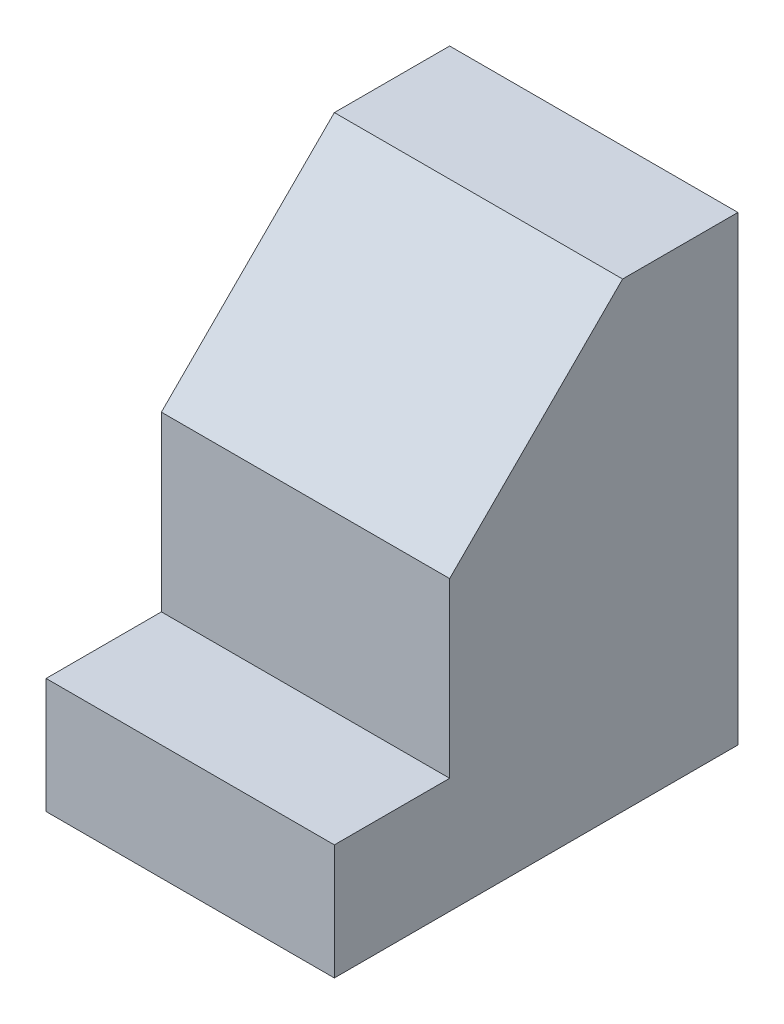
ISO-10303-21;
HEADER;
FILE_DESCRIPTION(('STEP AP214'),'2;1');
FILE_NAME('part.step','',(''),(''),'','','');
FILE_SCHEMA(('AUTOMOTIVE_DESIGN { 1 0 10303 214 1 1 1 1 }'));
ENDSEC;
DATA;
#1=APPLICATION_CONTEXT('core data for automotive mechanical design processes');
#2=APPLICATION_PROTOCOL_DEFINITION('international standard','automotive_design',2000,#1);
#3=PRODUCT_CONTEXT('',#1,'mechanical');
#4=PRODUCT('Part','Part','',(#3));
#5=PRODUCT_RELATED_PRODUCT_CATEGORY('part','',(#4));
#6=PRODUCT_DEFINITION_FORMATION('','',#4);
#7=PRODUCT_DEFINITION_CONTEXT('part definition',#1,'design');
#8=PRODUCT_DEFINITION('design','',#6,#7);
#9=PRODUCT_DEFINITION_SHAPE('','',#8);
#10=(LENGTH_UNIT() NAMED_UNIT(*) SI_UNIT(.MILLI.,.METRE.));
#11=(NAMED_UNIT(*) PLANE_ANGLE_UNIT() SI_UNIT($,.RADIAN.));
#12=(NAMED_UNIT(*) SI_UNIT($,.STERADIAN.) SOLID_ANGLE_UNIT());
#13=UNCERTAINTY_MEASURE_WITH_UNIT(LENGTH_MEASURE(1.E-05),#10,'distance_accuracy_value','');
#14=(GEOMETRIC_REPRESENTATION_CONTEXT(3) GLOBAL_UNCERTAINTY_ASSIGNED_CONTEXT((#13)) GLOBAL_UNIT_ASSIGNED_CONTEXT((#10,
#11,#12)) REPRESENTATION_CONTEXT('',''));
#15=CARTESIAN_POINT('',(0.,0.,0.));
#16=DIRECTION('',(0.,0.,1.));
#17=DIRECTION('',(1.,0.,0.));
#18=AXIS2_PLACEMENT_3D('',#15,#16,#17);
#19=CARTESIAN_POINT('',(0.,10000.,0.));
#20=DIRECTION('',(0.,-1.,0.));
#21=DIRECTION('',(0.,0.,-1.));
#22=AXIS2_PLACEMENT_3D('',#19,#20,#21);
#23=PLANE('',#22);
#24=DIRECTION('',(1.,0.,0.));
#25=VECTOR('',#24,1.);
#26=CARTESIAN_POINT('',(0.,10000.,-10000.));
#27=LINE('',#26,#25);
#28=CARTESIAN_POINT('',(3.06161699786838E-12,10000.,-10000.));
#29=VERTEX_POINT('',#28);
#30=CARTESIAN_POINT('',(25000.,10000.,-10000.));
#31=VERTEX_POINT('',#30);
#32=EDGE_CURVE('E109',#29,#31,#27,.T.);
#33=ORIENTED_EDGE('',*,*,#32,.F.);
#34=DIRECTION('',(0.,0.,-1.));
#35=VECTOR('',#34,1.);
#36=CARTESIAN_POINT('',(0.,10000.,0.));
#37=LINE('',#36,#35);
#38=CARTESIAN_POINT('',(0.,10000.,0.));
#39=VERTEX_POINT('',#38);
#40=EDGE_CURVE('E101',#39,#29,#37,.T.);
#41=ORIENTED_EDGE('',*,*,#40,.F.);
#42=DIRECTION('',(1.,0.,0.));
#43=VECTOR('',#42,1.);
#44=CARTESIAN_POINT('',(0.,10000.,0.));
#45=LINE('',#44,#43);
#46=CARTESIAN_POINT('',(25000.,10000.,0.));
#47=VERTEX_POINT('',#46);
#48=EDGE_CURVE('E90',#39,#47,#45,.T.);
#49=ORIENTED_EDGE('',*,*,#48,.T.);
#50=DIRECTION('',(0.,0.,1.));
#51=VECTOR('',#50,1.);
#52=CARTESIAN_POINT('',(25000.,10000.,-35000.));
#53=LINE('',#52,#51);
#54=EDGE_CURVE('E129',#31,#47,#53,.T.);
#55=ORIENTED_EDGE('',*,*,#54,.F.);
#56=EDGE_LOOP('',(#33,#41,#49,#55));
#57=FACE_BOUND('',#56,.T.);
#58=ADVANCED_FACE('F43',(#57),#23,.F.);
#59=CARTESIAN_POINT('',(0.,10000.,0.));
#60=DIRECTION('',(-1.,0.,0.));
#61=DIRECTION('',(0.,0.,1.));
#62=AXIS2_PLACEMENT_3D('',#59,#60,#61);
#63=PLANE('',#62);
#64=DIRECTION('',(0.,-1.,0.));
#65=VECTOR('',#64,1.);
#66=CARTESIAN_POINT('',(3.06161699786838E-12,25000.,-10000.));
#67=LINE('',#66,#65);
#68=CARTESIAN_POINT('',(0.,25000.,-10000.));
#69=VERTEX_POINT('',#68);
#70=EDGE_CURVE('E114',#69,#29,#67,.T.);
#71=ORIENTED_EDGE('',*,*,#70,.F.);
#72=DIRECTION('',(0.,-0.707106781186547,0.707106781186547));
#73=VECTOR('',#72,1.);
#74=CARTESIAN_POINT('',(0.,25000.,-10000.));
#75=LINE('',#74,#73);
#76=CARTESIAN_POINT('',(0.,40000.,-25000.));
#77=VERTEX_POINT('',#76);
#78=EDGE_CURVE('E162',#77,#69,#75,.T.);
#79=ORIENTED_EDGE('',*,*,#78,.F.);
#80=DIRECTION('',(0.,0.,1.));
#81=VECTOR('',#80,1.);
#82=CARTESIAN_POINT('',(0.,40000.,-35000.));
#83=LINE('',#82,#81);
#84=CARTESIAN_POINT('',(0.,40000.,-35000.));
#85=VERTEX_POINT('',#84);
#86=EDGE_CURVE('E153',#85,#77,#83,.T.);
#87=ORIENTED_EDGE('',*,*,#86,.F.);
#88=DIRECTION('',(0.,-1.,0.));
#89=VECTOR('',#88,1.);
#90=CARTESIAN_POINT('',(0.,10000.,-35000.));
#91=LINE('',#90,#89);
#92=CARTESIAN_POINT('',(0.,0.,-35000.));
#93=VERTEX_POINT('',#92);
#94=EDGE_CURVE('E47',#85,#93,#91,.T.);
#95=ORIENTED_EDGE('',*,*,#94,.T.);
#96=DIRECTION('',(0.,0.,-1.));
#97=VECTOR('',#96,1.);
#98=CARTESIAN_POINT('',(0.,0.,0.));
#99=LINE('',#98,#97);
#100=CARTESIAN_POINT('',(0.,0.,0.));
#101=VERTEX_POINT('',#100);
#102=EDGE_CURVE('E95',#101,#93,#99,.T.);
#103=ORIENTED_EDGE('',*,*,#102,.F.);
#104=DIRECTION('',(0.,-1.,0.));
#105=VECTOR('',#104,1.);
#106=CARTESIAN_POINT('',(0.,10000.,0.));
#107=LINE('',#106,#105);
#108=EDGE_CURVE('E11',#39,#101,#107,.T.);
#109=ORIENTED_EDGE('',*,*,#108,.F.);
#110=ORIENTED_EDGE('',*,*,#40,.T.);
#111=EDGE_LOOP('',(#71,#79,#87,#95,#103,#109,#110));
#112=FACE_BOUND('',#111,.T.);
#113=ADVANCED_FACE('F45',(#112),#63,.T.);
#114=CARTESIAN_POINT('',(0.,10000.,0.));
#115=DIRECTION('',(0.,0.,-1.));
#116=DIRECTION('',(-1.,0.,0.));
#117=AXIS2_PLACEMENT_3D('',#114,#115,#116);
#118=PLANE('',#117);
#119=DIRECTION('',(1.,0.,0.));
#120=VECTOR('',#119,1.);
#121=CARTESIAN_POINT('',(0.,0.,0.));
#122=LINE('',#121,#120);
#123=CARTESIAN_POINT('',(25000.,0.,0.));
#124=VERTEX_POINT('',#123);
#125=EDGE_CURVE('E88',#101,#124,#122,.T.);
#126=ORIENTED_EDGE('',*,*,#125,.T.);
#127=DIRECTION('',(0.,-1.,0.));
#128=VECTOR('',#127,1.);
#129=CARTESIAN_POINT('',(25000.,10000.,0.));
#130=LINE('',#129,#128);
#131=EDGE_CURVE('E53',#47,#124,#130,.T.);
#132=ORIENTED_EDGE('',*,*,#131,.F.);
#133=ORIENTED_EDGE('',*,*,#48,.F.);
#134=ORIENTED_EDGE('',*,*,#108,.T.);
#135=EDGE_LOOP('',(#126,#132,#133,#134));
#136=FACE_BOUND('',#135,.T.);
#137=ADVANCED_FACE('F86',(#136),#118,.F.);
#138=CARTESIAN_POINT('',(25000.,10000.,-35000.));
#139=DIRECTION('',(1.,0.,0.));
#140=DIRECTION('',(0.,0.,-1.));
#141=AXIS2_PLACEMENT_3D('',#138,#139,#140);
#142=PLANE('',#141);
#143=DIRECTION('',(0.,0.,-1.));
#144=VECTOR('',#143,1.);
#145=CARTESIAN_POINT('',(25000.,40000.,-35000.));
#146=LINE('',#145,#144);
#147=CARTESIAN_POINT('',(25000.,40000.,-25000.));
#148=VERTEX_POINT('',#147);
#149=CARTESIAN_POINT('',(25000.,40000.,-35000.));
#150=VERTEX_POINT('',#149);
#151=EDGE_CURVE('E145',#148,#150,#146,.T.);
#152=ORIENTED_EDGE('',*,*,#151,.F.);
#153=DIRECTION('',(0.,-0.707106781186547,0.707106781186547));
#154=VECTOR('',#153,1.);
#155=CARTESIAN_POINT('',(25000.,25000.,-10000.));
#156=LINE('',#155,#154);
#157=CARTESIAN_POINT('',(25000.,25000.,-10000.));
#158=VERTEX_POINT('',#157);
#159=EDGE_CURVE('E161',#148,#158,#156,.T.);
#160=ORIENTED_EDGE('',*,*,#159,.T.);
#161=DIRECTION('',(0.,-1.,0.));
#162=VECTOR('',#161,1.);
#163=CARTESIAN_POINT('',(25000.,25000.,-10000.));
#164=LINE('',#163,#162);
#165=EDGE_CURVE('E61',#158,#31,#164,.T.);
#166=ORIENTED_EDGE('',*,*,#165,.T.);
#167=ORIENTED_EDGE('',*,*,#54,.T.);
#168=ORIENTED_EDGE('',*,*,#131,.T.);
#169=DIRECTION('',(0.,0.,1.));
#170=VECTOR('',#169,1.);
#171=CARTESIAN_POINT('',(25000.,0.,-35000.));
#172=LINE('',#171,#170);
#173=CARTESIAN_POINT('',(25000.,0.,-35000.));
#174=VERTEX_POINT('',#173);
#175=EDGE_CURVE('E98',#174,#124,#172,.T.);
#176=ORIENTED_EDGE('',*,*,#175,.F.);
#177=DIRECTION('',(0.,-1.,0.));
#178=VECTOR('',#177,1.);
#179=CARTESIAN_POINT('',(25000.,10000.,-35000.));
#180=LINE('',#179,#178);
#181=EDGE_CURVE('E122',#150,#174,#180,.T.);
#182=ORIENTED_EDGE('',*,*,#181,.F.);
#183=EDGE_LOOP('',(#152,#160,#166,#167,#168,#176,#182));
#184=FACE_BOUND('',#183,.T.);
#185=ADVANCED_FACE('F170',(#184),#142,.T.);
#186=CARTESIAN_POINT('',(0.,10000.,-35000.));
#187=DIRECTION('',(0.,0.,-1.));
#188=DIRECTION('',(-1.,0.,0.));
#189=AXIS2_PLACEMENT_3D('',#186,#187,#188);
#190=PLANE('',#189);
#191=DIRECTION('',(1.,0.,0.));
#192=VECTOR('',#191,1.);
#193=CARTESIAN_POINT('',(0.,0.,-35000.));
#194=LINE('',#193,#192);
#195=EDGE_CURVE('E108',#93,#174,#194,.T.);
#196=ORIENTED_EDGE('',*,*,#195,.F.);
#197=ORIENTED_EDGE('',*,*,#94,.F.);
#198=DIRECTION('',(-1.,0.,0.));
#199=VECTOR('',#198,1.);
#200=CARTESIAN_POINT('',(0.,40000.,-35000.));
#201=LINE('',#200,#199);
#202=EDGE_CURVE('E157',#150,#85,#201,.T.);
#203=ORIENTED_EDGE('',*,*,#202,.F.);
#204=ORIENTED_EDGE('',*,*,#181,.T.);
#205=EDGE_LOOP('',(#196,#197,#203,#204));
#206=FACE_BOUND('',#205,.T.);
#207=ADVANCED_FACE('F193',(#206),#190,.T.);
#208=CARTESIAN_POINT('',(0.,0.,0.));
#209=DIRECTION('',(0.,-1.,0.));
#210=DIRECTION('',(0.,0.,-1.));
#211=AXIS2_PLACEMENT_3D('',#208,#209,#210);
#212=PLANE('',#211);
#213=ORIENTED_EDGE('',*,*,#175,.T.);
#214=ORIENTED_EDGE('',*,*,#125,.F.);
#215=ORIENTED_EDGE('',*,*,#102,.T.);
#216=ORIENTED_EDGE('',*,*,#195,.T.);
#217=EDGE_LOOP('',(#213,#214,#215,#216));
#218=FACE_BOUND('',#217,.T.);
#219=ADVANCED_FACE('F93',(#218),#212,.T.);
#220=CARTESIAN_POINT('',(3.06161699786838E-12,25000.,-10000.));
#221=DIRECTION('',(0.,0.,-1.));
#222=DIRECTION('',(-1.,0.,0.));
#223=AXIS2_PLACEMENT_3D('',#220,#221,#222);
#224=PLANE('',#223);
#225=ORIENTED_EDGE('',*,*,#70,.T.);
#226=ORIENTED_EDGE('',*,*,#32,.T.);
#227=ORIENTED_EDGE('',*,*,#165,.F.);
#228=DIRECTION('',(1.,0.,0.));
#229=VECTOR('',#228,1.);
#230=CARTESIAN_POINT('',(3.06161699786838E-12,25000.,-10000.));
#231=LINE('',#230,#229);
#232=EDGE_CURVE('E141',#69,#158,#231,.T.);
#233=ORIENTED_EDGE('',*,*,#232,.F.);
#234=EDGE_LOOP('',(#225,#226,#227,#233));
#235=FACE_BOUND('',#234,.T.);
#236=ADVANCED_FACE('F181',(#235),#224,.F.);
#237=CARTESIAN_POINT('',(0.,40000.,0.));
#238=DIRECTION('',(0.,-1.,0.));
#239=DIRECTION('',(0.,0.,-1.));
#240=AXIS2_PLACEMENT_3D('',#237,#238,#239);
#241=PLANE('',#240);
#242=ORIENTED_EDGE('',*,*,#202,.T.);
#243=ORIENTED_EDGE('',*,*,#86,.T.);
#244=DIRECTION('',(1.,0.,0.));
#245=VECTOR('',#244,1.);
#246=CARTESIAN_POINT('',(25000.,40000.,-25000.));
#247=LINE('',#246,#245);
#248=EDGE_CURVE('E149',#77,#148,#247,.T.);
#249=ORIENTED_EDGE('',*,*,#248,.T.);
#250=ORIENTED_EDGE('',*,*,#151,.T.);
#251=EDGE_LOOP('',(#242,#243,#249,#250));
#252=FACE_BOUND('',#251,.T.);
#253=ADVANCED_FACE('F204',(#252),#241,.F.);
#254=CARTESIAN_POINT('',(25000.,25000.,-10000.));
#255=DIRECTION('',(0.,-0.707106781186548,-0.707106781186548));
#256=DIRECTION('',(0.,0.707106781186548,-0.707106781186548));
#257=AXIS2_PLACEMENT_3D('',#254,#255,#256);
#258=PLANE('',#257);
#259=ORIENTED_EDGE('',*,*,#78,.T.);
#260=ORIENTED_EDGE('',*,*,#232,.T.);
#261=ORIENTED_EDGE('',*,*,#159,.F.);
#262=ORIENTED_EDGE('',*,*,#248,.F.);
#263=EDGE_LOOP('',(#259,#260,#261,#262));
#264=FACE_BOUND('',#263,.T.);
#265=ADVANCED_FACE('F178',(#264),#258,.F.);
#266=CLOSED_SHELL('',(#58,#113,#137,#185,#207,#219,#236,#253,#265));
#267=MANIFOLD_SOLID_BREP('B2',#266);
#268=ADVANCED_BREP_SHAPE_REPRESENTATION('',(#18,#267),#14);
#269=SHAPE_DEFINITION_REPRESENTATION(#9,#268);
ENDSEC;
END-ISO-10303-21;
